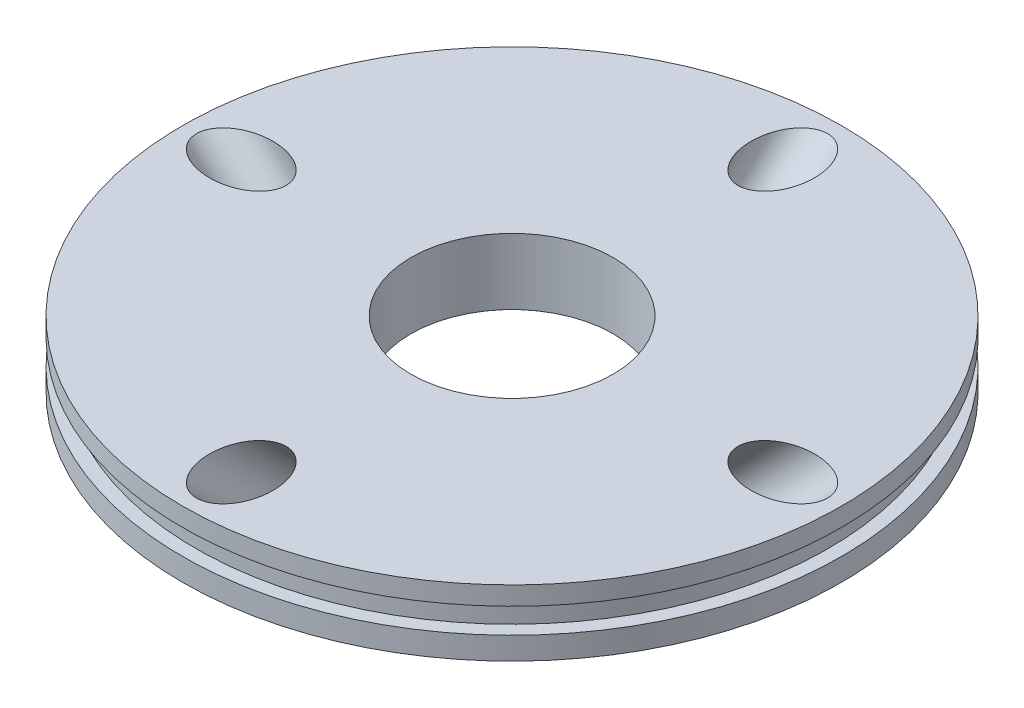
ISO-10303-21;
HEADER;
FILE_DESCRIPTION(('STEP AP214'),'2;1');
FILE_NAME('part.step','',(''),(''),'','','');
FILE_SCHEMA(('AUTOMOTIVE_DESIGN { 1 0 10303 214 1 1 1 1 }'));
ENDSEC;
DATA;
#1=APPLICATION_CONTEXT('core data for automotive mechanical design processes');
#2=APPLICATION_PROTOCOL_DEFINITION('international standard','automotive_design',2000,#1);
#3=PRODUCT_CONTEXT('',#1,'mechanical');
#4=PRODUCT('Part','Part','',(#3));
#5=PRODUCT_RELATED_PRODUCT_CATEGORY('part','',(#4));
#6=PRODUCT_DEFINITION_FORMATION('','',#4);
#7=PRODUCT_DEFINITION_CONTEXT('part definition',#1,'design');
#8=PRODUCT_DEFINITION('design','',#6,#7);
#9=PRODUCT_DEFINITION_SHAPE('','',#8);
#10=(LENGTH_UNIT() NAMED_UNIT(*) SI_UNIT(.MILLI.,.METRE.));
#11=(NAMED_UNIT(*) PLANE_ANGLE_UNIT() SI_UNIT($,.RADIAN.));
#12=(NAMED_UNIT(*) SI_UNIT($,.STERADIAN.) SOLID_ANGLE_UNIT());
#13=UNCERTAINTY_MEASURE_WITH_UNIT(LENGTH_MEASURE(1.E-05),#10,'distance_accuracy_value','');
#14=(GEOMETRIC_REPRESENTATION_CONTEXT(3) GLOBAL_UNCERTAINTY_ASSIGNED_CONTEXT((#13)) GLOBAL_UNIT_ASSIGNED_CONTEXT((#10,
#11,#12)) REPRESENTATION_CONTEXT('',''));
#15=CARTESIAN_POINT('',(0.,0.,0.));
#16=DIRECTION('',(0.,0.,1.));
#17=DIRECTION('',(1.,0.,0.));
#18=AXIS2_PLACEMENT_3D('',#15,#16,#17);
#19=CARTESIAN_POINT('',(0.,6.35,0.));
#20=DIRECTION('',(0.,-1.,0.));
#21=DIRECTION('',(0.,0.,-1.));
#22=AXIS2_PLACEMENT_3D('',#19,#20,#21);
#23=CYLINDRICAL_SURFACE('',#22,31.6865);
#24=CARTESIAN_POINT('',(0.,4.572,0.));
#25=DIRECTION('',(0.,-1.,0.));
#26=DIRECTION('',(0.,0.,-1.));
#27=AXIS2_PLACEMENT_3D('',#24,#25,#26);
#28=CIRCLE('',#27,31.6865);
#29=CARTESIAN_POINT('',(0.,4.572,-31.6865));
#30=VERTEX_POINT('',#29);
#31=EDGE_CURVE('E140',#30,#30,#28,.T.);
#32=ORIENTED_EDGE('',*,*,#31,.F.);
#33=EDGE_LOOP('',(#32));
#34=FACE_BOUND('',#33,.T.);
#35=CARTESIAN_POINT('',(0.,6.35,0.));
#36=DIRECTION('',(0.,1.,0.));
#37=DIRECTION('',(0.,0.,1.));
#38=AXIS2_PLACEMENT_3D('',#35,#36,#37);
#39=CIRCLE('',#38,31.6865);
#40=CARTESIAN_POINT('',(0.,6.35,31.6865));
#41=VERTEX_POINT('',#40);
#42=EDGE_CURVE('E12',#41,#41,#39,.T.);
#43=ORIENTED_EDGE('',*,*,#42,.F.);
#44=EDGE_LOOP('',(#43));
#45=FACE_BOUND('',#44,.T.);
#46=ADVANCED_FACE('F44',(#34,#45),#23,.T.);
#47=CARTESIAN_POINT('',(0.,6.35,0.));
#48=DIRECTION('',(0.,1.,0.));
#49=DIRECTION('',(0.,0.,1.));
#50=AXIS2_PLACEMENT_3D('',#47,#48,#49);
#51=PLANE('',#50);
#52=CARTESIAN_POINT('',(0.,6.35,0.));
#53=DIRECTION('',(0.,1.,0.));
#54=DIRECTION('',(0.,0.,1.));
#55=AXIS2_PLACEMENT_3D('',#52,#53,#54);
#56=CIRCLE('',#55,9.72312);
#57=CARTESIAN_POINT('',(0.,6.35,9.72312));
#58=VERTEX_POINT('',#57);
#59=EDGE_CURVE('E150',#58,#58,#56,.T.);
#60=ORIENTED_EDGE('',*,*,#59,.F.);
#61=EDGE_LOOP('',(#60));
#62=FACE_BOUND('',#61,.T.);
#63=CARTESIAN_POINT('',(26.035,6.35,0.));
#64=DIRECTION('',(0.,1.,0.));
#65=DIRECTION('',(1.,0.,0.));
#66=AXIS2_PLACEMENT_3D('',#63,#64,#65);
#67=ELLIPSE('',#66,4.31052293811322,3.048);
#68=CARTESIAN_POINT('',(30.3455229381132,6.35,0.));
#69=VERTEX_POINT('',#68);
#70=EDGE_CURVE('E68',#69,#69,#67,.F.);
#71=ORIENTED_EDGE('',*,*,#70,.T.);
#72=EDGE_LOOP('',(#71));
#73=FACE_BOUND('',#72,.T.);
#74=CARTESIAN_POINT('',(-26.035,6.35,0.));
#75=DIRECTION('',(0.,1.,0.));
#76=DIRECTION('',(-1.,0.,0.));
#77=AXIS2_PLACEMENT_3D('',#74,#75,#76);
#78=ELLIPSE('',#77,4.31052293811322,3.048);
#79=CARTESIAN_POINT('',(-30.3455229381132,6.35,0.));
#80=VERTEX_POINT('',#79);
#81=EDGE_CURVE('E57',#80,#80,#78,.F.);
#82=ORIENTED_EDGE('',*,*,#81,.T.);
#83=EDGE_LOOP('',(#82));
#84=FACE_BOUND('',#83,.T.);
#85=ORIENTED_EDGE('',*,*,#42,.T.);
#86=EDGE_LOOP('',(#85));
#87=FACE_BOUND('',#86,.T.);
#88=CARTESIAN_POINT('',(0.,6.35,26.035));
#89=DIRECTION('',(0.,1.,0.));
#90=DIRECTION('',(0.,0.,1.));
#91=AXIS2_PLACEMENT_3D('',#88,#89,#90);
#92=ELLIPSE('',#91,4.31052293811322,3.048);
#93=CARTESIAN_POINT('',(1.05950827055859E-13,6.35,30.3455229381132));
#94=VERTEX_POINT('',#93);
#95=EDGE_CURVE('E65',#94,#94,#92,.F.);
#96=ORIENTED_EDGE('',*,*,#95,.T.);
#97=EDGE_LOOP('',(#96));
#98=FACE_BOUND('',#97,.T.);
#99=CARTESIAN_POINT('',(-2.72702149970343E-13,6.35,-26.035));
#100=DIRECTION('',(0.,1.,0.));
#101=DIRECTION('',(0.,0.,-1.));
#102=AXIS2_PLACEMENT_3D('',#99,#100,#101);
#103=ELLIPSE('',#102,4.31052293811322,3.048);
#104=CARTESIAN_POINT('',(-3.17852481167576E-13,6.35,-30.3455229381132));
#105=VERTEX_POINT('',#104);
#106=EDGE_CURVE('E71',#105,#105,#103,.F.);
#107=ORIENTED_EDGE('',*,*,#106,.T.);
#108=EDGE_LOOP('',(#107));
#109=FACE_BOUND('',#108,.T.);
#110=ADVANCED_FACE('F87',(#62,#73,#84,#87,#98,#109),#51,.T.);
#111=CARTESIAN_POINT('',(0.,0.,0.));
#112=DIRECTION('',(0.,1.,0.));
#113=DIRECTION('',(0.,0.,1.));
#114=AXIS2_PLACEMENT_3D('',#111,#112,#113);
#115=PLANE('',#114);
#116=CARTESIAN_POINT('',(0.,0.,0.));
#117=DIRECTION('',(0.,1.,0.));
#118=DIRECTION('',(0.,0.,1.));
#119=AXIS2_PLACEMENT_3D('',#116,#117,#118);
#120=CIRCLE('',#119,9.72312);
#121=CARTESIAN_POINT('',(0.,0.,9.72312));
#122=VERTEX_POINT('',#121);
#123=EDGE_CURVE('E145',#122,#122,#120,.T.);
#124=ORIENTED_EDGE('',*,*,#123,.T.);
#125=EDGE_LOOP('',(#124));
#126=FACE_BOUND('',#125,.T.);
#127=CARTESIAN_POINT('',(19.685,0.,0.));
#128=DIRECTION('',(0.,1.,0.));
#129=DIRECTION('',(1.,0.,0.));
#130=AXIS2_PLACEMENT_3D('',#127,#128,#129);
#131=ELLIPSE('',#130,4.31052293811322,3.048);
#132=CARTESIAN_POINT('',(23.9955229381132,0.,0.));
#133=VERTEX_POINT('',#132);
#134=EDGE_CURVE('E69',#133,#133,#131,.F.);
#135=ORIENTED_EDGE('',*,*,#134,.F.);
#136=EDGE_LOOP('',(#135));
#137=FACE_BOUND('',#136,.T.);
#138=CARTESIAN_POINT('',(-19.685,0.,0.));
#139=DIRECTION('',(0.,1.,0.));
#140=DIRECTION('',(-1.,0.,0.));
#141=AXIS2_PLACEMENT_3D('',#138,#139,#140);
#142=ELLIPSE('',#141,4.31052293811322,3.048);
#143=CARTESIAN_POINT('',(-23.9955229381132,0.,0.));
#144=VERTEX_POINT('',#143);
#145=EDGE_CURVE('E62',#144,#144,#142,.F.);
#146=ORIENTED_EDGE('',*,*,#145,.F.);
#147=EDGE_LOOP('',(#146));
#148=FACE_BOUND('',#147,.T.);
#149=CARTESIAN_POINT('',(0.,0.,0.));
#150=DIRECTION('',(0.,1.,0.));
#151=DIRECTION('',(0.,0.,1.));
#152=AXIS2_PLACEMENT_3D('',#149,#150,#151);
#153=CIRCLE('',#152,31.6865);
#154=CARTESIAN_POINT('',(0.,0.,31.6865));
#155=VERTEX_POINT('',#154);
#156=EDGE_CURVE('E52',#155,#155,#153,.T.);
#157=ORIENTED_EDGE('',*,*,#156,.F.);
#158=EDGE_LOOP('',(#157));
#159=FACE_BOUND('',#158,.T.);
#160=CARTESIAN_POINT('',(0.,0.,19.685));
#161=DIRECTION('',(0.,1.,0.));
#162=DIRECTION('',(0.,0.,1.));
#163=AXIS2_PLACEMENT_3D('',#160,#161,#162);
#164=ELLIPSE('',#163,4.31052293811322,3.048);
#165=CARTESIAN_POINT('',(0.,0.,23.9955229381132));
#166=VERTEX_POINT('',#165);
#167=EDGE_CURVE('E66',#166,#166,#164,.F.);
#168=ORIENTED_EDGE('',*,*,#167,.F.);
#169=EDGE_LOOP('',(#168));
#170=FACE_BOUND('',#169,.T.);
#171=CARTESIAN_POINT('',(-2.06189430465381E-13,0.,-19.685));
#172=DIRECTION('',(0.,1.,0.));
#173=DIRECTION('',(0.,0.,-1.));
#174=AXIS2_PLACEMENT_3D('',#171,#172,#173);
#175=ELLIPSE('',#174,4.31052293811322,3.048);
#176=CARTESIAN_POINT('',(-2.51339761662614E-13,0.,-23.9955229381132));
#177=VERTEX_POINT('',#176);
#178=EDGE_CURVE('E48',#177,#177,#175,.F.);
#179=ORIENTED_EDGE('',*,*,#178,.F.);
#180=EDGE_LOOP('',(#179));
#181=FACE_BOUND('',#180,.T.);
#182=ADVANCED_FACE('F97',(#126,#137,#148,#159,#170,#181),#115,.F.);
#183=CARTESIAN_POINT('',(0.,2.159,0.));
#184=DIRECTION('',(0.,-1.,0.));
#185=DIRECTION('',(0.,0.,-1.));
#186=AXIS2_PLACEMENT_3D('',#183,#184,#185);
#187=CIRCLE('',#186,31.6865);
#188=CARTESIAN_POINT('',(0.,2.159,-31.6865));
#189=VERTEX_POINT('',#188);
#190=EDGE_CURVE('E136',#189,#189,#187,.T.);
#191=ORIENTED_EDGE('',*,*,#190,.T.);
#192=EDGE_LOOP('',(#191));
#193=FACE_BOUND('',#192,.T.);
#194=ORIENTED_EDGE('',*,*,#156,.T.);
#195=EDGE_LOOP('',(#194));
#196=FACE_BOUND('',#195,.T.);
#197=ADVANCED_FACE('F46',(#193,#196),#23,.T.);
#198=CARTESIAN_POINT('',(-28.4726600756682,8.78766007566819,0.));
#199=DIRECTION('',(-0.707106781186551,0.707106781186544,0.));
#200=DIRECTION('',(-0.707106781186544,-0.707106781186551,0.));
#201=AXIS2_PLACEMENT_3D('',#198,#199,#200);
#202=CYLINDRICAL_SURFACE('',#201,3.048);
#203=ORIENTED_EDGE('',*,*,#81,.F.);
#204=EDGE_LOOP('',(#203));
#205=FACE_BOUND('',#204,.T.);
#206=ORIENTED_EDGE('',*,*,#145,.T.);
#207=EDGE_LOOP('',(#206));
#208=FACE_BOUND('',#207,.T.);
#209=ADVANCED_FACE('F93',(#205,#208),#202,.F.);
#210=CARTESIAN_POINT('',(0.,8.78766007566819,28.4726600756682));
#211=DIRECTION('',(0.,0.707106781186544,0.707106781186551));
#212=DIRECTION('',(0.,-0.707106781186551,0.707106781186544));
#213=AXIS2_PLACEMENT_3D('',#210,#211,#212);
#214=CYLINDRICAL_SURFACE('',#213,3.048);
#215=ORIENTED_EDGE('',*,*,#95,.F.);
#216=EDGE_LOOP('',(#215));
#217=FACE_BOUND('',#216,.T.);
#218=ORIENTED_EDGE('',*,*,#167,.T.);
#219=EDGE_LOOP('',(#218));
#220=FACE_BOUND('',#219,.T.);
#221=ADVANCED_FACE('F89',(#217,#220),#214,.F.);
#222=CARTESIAN_POINT('',(28.4726600756682,8.78766007566819,0.));
#223=DIRECTION('',(0.707106781186551,0.707106781186544,0.));
#224=DIRECTION('',(0.707106781186544,-0.707106781186551,0.));
#225=AXIS2_PLACEMENT_3D('',#222,#223,#224);
#226=CYLINDRICAL_SURFACE('',#225,3.048);
#227=ORIENTED_EDGE('',*,*,#70,.F.);
#228=EDGE_LOOP('',(#227));
#229=FACE_BOUND('',#228,.T.);
#230=ORIENTED_EDGE('',*,*,#134,.T.);
#231=EDGE_LOOP('',(#230));
#232=FACE_BOUND('',#231,.T.);
#233=ADVANCED_FACE('F92',(#229,#232),#226,.F.);
#234=CARTESIAN_POINT('',(-2.98235283964259E-13,8.78766007566819,-28.4726600756682));
#235=DIRECTION('',(0.,0.707106781186544,-0.707106781186551));
#236=DIRECTION('',(0.,-0.707106781186551,-0.707106781186544));
#237=AXIS2_PLACEMENT_3D('',#234,#235,#236);
#238=CYLINDRICAL_SURFACE('',#237,3.048);
#239=ORIENTED_EDGE('',*,*,#106,.F.);
#240=EDGE_LOOP('',(#239));
#241=FACE_BOUND('',#240,.T.);
#242=ORIENTED_EDGE('',*,*,#178,.T.);
#243=EDGE_LOOP('',(#242));
#244=FACE_BOUND('',#243,.T.);
#245=ADVANCED_FACE('F103',(#241,#244),#238,.F.);
#246=CARTESIAN_POINT('',(0.,-0.3175,0.));
#247=DIRECTION('',(0.,-1.,0.));
#248=DIRECTION('',(0.,0.,-1.));
#249=AXIS2_PLACEMENT_3D('',#246,#247,#248);
#250=CYLINDRICAL_SURFACE('',#249,30.3911);
#251=CARTESIAN_POINT('',(0.,2.159,0.));
#252=DIRECTION('',(0.,-1.,0.));
#253=DIRECTION('',(0.,0.,-1.));
#254=AXIS2_PLACEMENT_3D('',#251,#252,#253);
#255=CIRCLE('',#254,30.3911);
#256=CARTESIAN_POINT('',(0.,2.159,-30.3911));
#257=VERTEX_POINT('',#256);
#258=EDGE_CURVE('E141',#257,#257,#255,.T.);
#259=ORIENTED_EDGE('',*,*,#258,.F.);
#260=EDGE_LOOP('',(#259));
#261=FACE_BOUND('',#260,.T.);
#262=CARTESIAN_POINT('',(0.,4.572,0.));
#263=DIRECTION('',(0.,-1.,0.));
#264=DIRECTION('',(0.,0.,-1.));
#265=AXIS2_PLACEMENT_3D('',#262,#263,#264);
#266=CIRCLE('',#265,30.3911);
#267=CARTESIAN_POINT('',(0.,4.572,-30.3911));
#268=VERTEX_POINT('',#267);
#269=EDGE_CURVE('E81',#268,#268,#266,.T.);
#270=ORIENTED_EDGE('',*,*,#269,.T.);
#271=EDGE_LOOP('',(#270));
#272=FACE_BOUND('',#271,.T.);
#273=ADVANCED_FACE('F105',(#261,#272),#250,.T.);
#274=CARTESIAN_POINT('',(30.3911,4.572,0.));
#275=DIRECTION('',(0.,1.,0.));
#276=DIRECTION('',(0.,0.,1.));
#277=AXIS2_PLACEMENT_3D('',#274,#275,#276);
#278=PLANE('',#277);
#279=ORIENTED_EDGE('',*,*,#269,.F.);
#280=EDGE_LOOP('',(#279));
#281=FACE_BOUND('',#280,.T.);
#282=ORIENTED_EDGE('',*,*,#31,.T.);
#283=EDGE_LOOP('',(#282));
#284=FACE_BOUND('',#283,.T.);
#285=ADVANCED_FACE('F112',(#281,#284),#278,.F.);
#286=CARTESIAN_POINT('',(30.3911,2.159,0.));
#287=DIRECTION('',(0.,-1.,0.));
#288=DIRECTION('',(0.,0.,-1.));
#289=AXIS2_PLACEMENT_3D('',#286,#287,#288);
#290=PLANE('',#289);
#291=ORIENTED_EDGE('',*,*,#190,.F.);
#292=EDGE_LOOP('',(#291));
#293=FACE_BOUND('',#292,.T.);
#294=ORIENTED_EDGE('',*,*,#258,.T.);
#295=EDGE_LOOP('',(#294));
#296=FACE_BOUND('',#295,.T.);
#297=ADVANCED_FACE('F164',(#293,#296),#290,.F.);
#298=CARTESIAN_POINT('',(0.,6.35,0.));
#299=DIRECTION('',(0.,1.,0.));
#300=DIRECTION('',(0.,0.,1.));
#301=AXIS2_PLACEMENT_3D('',#298,#299,#300);
#302=CYLINDRICAL_SURFACE('',#301,9.72312);
#303=ORIENTED_EDGE('',*,*,#123,.F.);
#304=EDGE_LOOP('',(#303));
#305=FACE_BOUND('',#304,.T.);
#306=ORIENTED_EDGE('',*,*,#59,.T.);
#307=EDGE_LOOP('',(#306));
#308=FACE_BOUND('',#307,.T.);
#309=ADVANCED_FACE('F154',(#305,#308),#302,.F.);
#310=CLOSED_SHELL('',(#46,#110,#182,#197,#209,#221,#233,#245,#273,#285,#297,#309));
#311=MANIFOLD_SOLID_BREP('B2',#310);
#312=ADVANCED_BREP_SHAPE_REPRESENTATION('',(#18,#311),#14);
#313=SHAPE_DEFINITION_REPRESENTATION(#9,#312);
ENDSEC;
END-ISO-10303-21;
